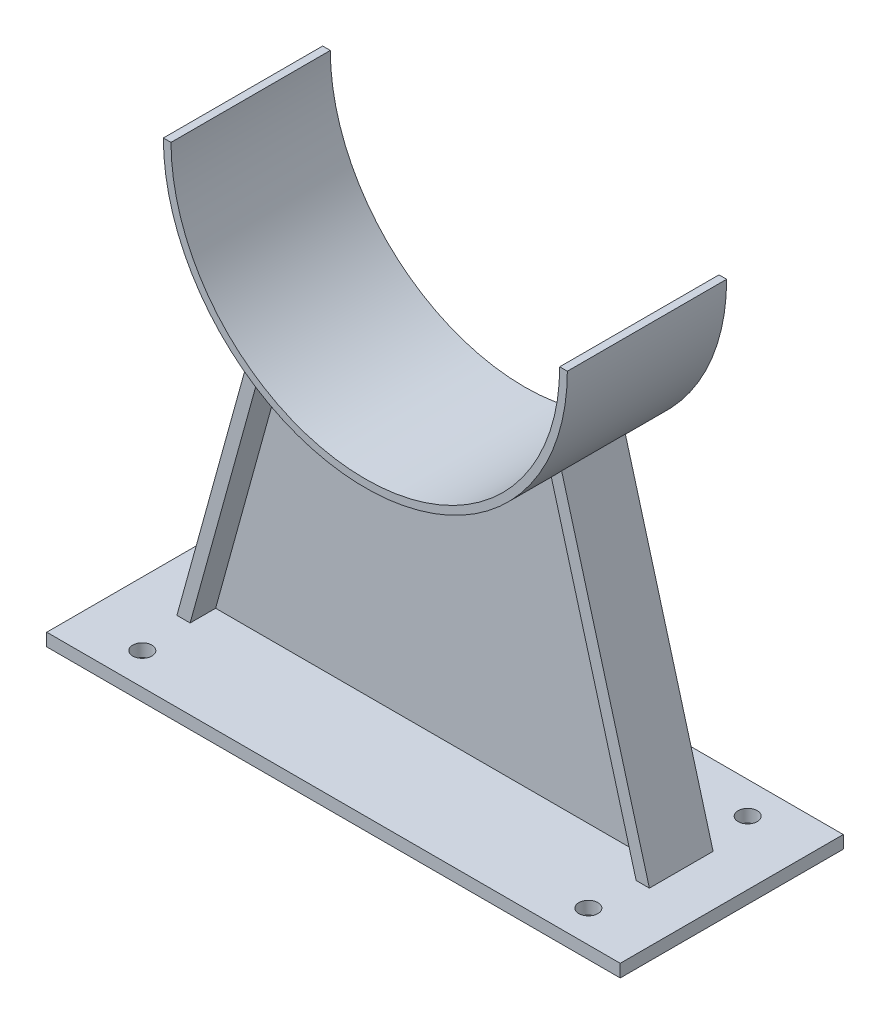
ISO-10303-21;
HEADER;
FILE_DESCRIPTION(('STEP AP214'),'2;1');
FILE_NAME('part.step','',(''),(''),'','','');
FILE_SCHEMA(('AUTOMOTIVE_DESIGN { 1 0 10303 214 1 1 1 1 }'));
ENDSEC;
DATA;
#1=APPLICATION_CONTEXT('core data for automotive mechanical design processes');
#2=APPLICATION_PROTOCOL_DEFINITION('international standard','automotive_design',2000,#1);
#3=PRODUCT_CONTEXT('',#1,'mechanical');
#4=PRODUCT('Part','Part','',(#3));
#5=PRODUCT_RELATED_PRODUCT_CATEGORY('part','',(#4));
#6=PRODUCT_DEFINITION_FORMATION('','',#4);
#7=PRODUCT_DEFINITION_CONTEXT('part definition',#1,'design');
#8=PRODUCT_DEFINITION('design','',#6,#7);
#9=PRODUCT_DEFINITION_SHAPE('','',#8);
#10=(LENGTH_UNIT() NAMED_UNIT(*) SI_UNIT(.MILLI.,.METRE.));
#11=(NAMED_UNIT(*) PLANE_ANGLE_UNIT() SI_UNIT($,.RADIAN.));
#12=(NAMED_UNIT(*) SI_UNIT($,.STERADIAN.) SOLID_ANGLE_UNIT());
#13=UNCERTAINTY_MEASURE_WITH_UNIT(LENGTH_MEASURE(1.E-05),#10,'distance_accuracy_value','');
#14=(GEOMETRIC_REPRESENTATION_CONTEXT(3) GLOBAL_UNCERTAINTY_ASSIGNED_CONTEXT((#13)) GLOBAL_UNIT_ASSIGNED_CONTEXT((#10,
#11,#12)) REPRESENTATION_CONTEXT('',''));
#15=CARTESIAN_POINT('',(0.,0.,0.));
#16=DIRECTION('',(0.,0.,1.));
#17=DIRECTION('',(1.,0.,0.));
#18=AXIS2_PLACEMENT_3D('',#15,#16,#17);
#19=CARTESIAN_POINT('',(0.,0.,125.));
#20=DIRECTION('',(0.,0.,-1.));
#21=DIRECTION('',(-1.,0.,0.));
#22=AXIS2_PLACEMENT_3D('',#19,#20,#21);
#23=CYLINDRICAL_SURFACE('',#22,317.);
#24=CARTESIAN_POINT('',(0.,0.,-125.));
#25=DIRECTION('',(0.,0.,1.));
#26=DIRECTION('',(1.,0.,0.));
#27=AXIS2_PLACEMENT_3D('',#24,#25,#26);
#28=CIRCLE('',#27,317.);
#29=CARTESIAN_POINT('',(-317.,0.,-125.));
#30=VERTEX_POINT('',#29);
#31=CARTESIAN_POINT('',(317.,0.,-125.));
#32=VERTEX_POINT('',#31);
#33=EDGE_CURVE('E204',#30,#32,#28,.T.);
#34=ORIENTED_EDGE('',*,*,#33,.T.);
#35=DIRECTION('',(0.,0.,-1.));
#36=VECTOR('',#35,1.);
#37=CARTESIAN_POINT('',(317.,0.,125.));
#38=LINE('',#37,#36);
#39=CARTESIAN_POINT('',(317.,0.,125.));
#40=VERTEX_POINT('',#39);
#41=EDGE_CURVE('E226',#40,#32,#38,.T.);
#42=ORIENTED_EDGE('',*,*,#41,.F.);
#43=CARTESIAN_POINT('',(0.,0.,125.));
#44=DIRECTION('',(0.,0.,1.));
#45=DIRECTION('',(1.,0.,0.));
#46=AXIS2_PLACEMENT_3D('',#43,#44,#45);
#47=CIRCLE('',#46,317.);
#48=CARTESIAN_POINT('',(-317.,0.,125.));
#49=VERTEX_POINT('',#48);
#50=EDGE_CURVE('E209',#49,#40,#47,.T.);
#51=ORIENTED_EDGE('',*,*,#50,.F.);
#52=DIRECTION('',(0.,0.,-1.));
#53=VECTOR('',#52,1.);
#54=CARTESIAN_POINT('',(-317.,0.,125.));
#55=LINE('',#54,#53);
#56=EDGE_CURVE('E223',#49,#30,#55,.T.);
#57=ORIENTED_EDGE('',*,*,#56,.T.);
#58=EDGE_LOOP('',(#34,#42,#51,#57));
#59=FACE_BOUND('',#58,.T.);
#60=DIRECTION('',(0.,0.,-1.));
#61=VECTOR('',#60,1.);
#62=CARTESIAN_POINT('',(216.821053663193,-231.25230958497,125.));
#63=LINE('',#62,#61);
#64=CARTESIAN_POINT('',(216.821053663193,-231.25230958497,50.));
#65=VERTEX_POINT('',#64);
#66=CARTESIAN_POINT('',(216.821053663193,-231.25230958497,9.99999999999999));
#67=VERTEX_POINT('',#66);
#68=EDGE_CURVE('E48',#65,#67,#63,.T.);
#69=ORIENTED_EDGE('',*,*,#68,.F.);
#70=CARTESIAN_POINT('',(0.,0.,50.));
#71=DIRECTION('',(0.,0.,1.));
#72=DIRECTION('',(0.,-1.,0.));
#73=AXIS2_PLACEMENT_3D('',#70,#71,#72);
#74=CIRCLE('',#73,317.);
#75=CARTESIAN_POINT('',(233.048785249764,-214.888956658106,50.0000000000001));
#76=VERTEX_POINT('',#75);
#77=EDGE_CURVE('E52',#65,#76,#74,.T.);
#78=ORIENTED_EDGE('',*,*,#77,.T.);
#79=DIRECTION('',(0.,0.,-1.));
#80=VECTOR('',#79,1.);
#81=CARTESIAN_POINT('',(233.048785249764,-214.888956658106,125.));
#82=LINE('',#81,#80);
#83=CARTESIAN_POINT('',(233.048785249764,-214.888956658106,-50.));
#84=VERTEX_POINT('',#83);
#85=EDGE_CURVE('E261',#76,#84,#82,.T.);
#86=ORIENTED_EDGE('',*,*,#85,.T.);
#87=CARTESIAN_POINT('',(0.,0.,-50.));
#88=DIRECTION('',(0.,0.,-1.));
#89=DIRECTION('',(0.,1.,0.));
#90=AXIS2_PLACEMENT_3D('',#87,#88,#89);
#91=CIRCLE('',#90,317.);
#92=CARTESIAN_POINT('',(216.821053663193,-231.25230958497,-50.));
#93=VERTEX_POINT('',#92);
#94=EDGE_CURVE('E181',#84,#93,#91,.T.);
#95=ORIENTED_EDGE('',*,*,#94,.T.);
#96=CARTESIAN_POINT('',(216.821053663193,-231.25230958497,-10.));
#97=VERTEX_POINT('',#96);
#98=EDGE_CURVE('E179',#97,#93,#63,.T.);
#99=ORIENTED_EDGE('',*,*,#98,.F.);
#100=CARTESIAN_POINT('',(0.,0.,-10.));
#101=DIRECTION('',(0.,0.,-1.));
#102=DIRECTION('',(1.,0.,0.));
#103=AXIS2_PLACEMENT_3D('',#100,#101,#102);
#104=CIRCLE('',#103,317.);
#105=CARTESIAN_POINT('',(-216.821053663193,-231.25230958497,-10.));
#106=VERTEX_POINT('',#105);
#107=EDGE_CURVE('E166',#97,#106,#104,.T.);
#108=ORIENTED_EDGE('',*,*,#107,.T.);
#109=DIRECTION('',(0.,0.,-1.));
#110=VECTOR('',#109,1.);
#111=CARTESIAN_POINT('',(-216.821053663193,-231.25230958497,125.));
#112=LINE('',#111,#110);
#113=CARTESIAN_POINT('',(-216.821053663193,-231.25230958497,-50.));
#114=VERTEX_POINT('',#113);
#115=EDGE_CURVE('E286',#114,#106,#112,.F.);
#116=ORIENTED_EDGE('',*,*,#115,.F.);
#117=CARTESIAN_POINT('',(0.,0.,-50.));
#118=DIRECTION('',(0.,0.,1.));
#119=DIRECTION('',(0.,-1.,0.));
#120=AXIS2_PLACEMENT_3D('',#117,#118,#119);
#121=CIRCLE('',#120,317.);
#122=CARTESIAN_POINT('',(-233.048785249764,-214.888956658106,-50.));
#123=VERTEX_POINT('',#122);
#124=EDGE_CURVE('E293',#123,#114,#121,.T.);
#125=ORIENTED_EDGE('',*,*,#124,.F.);
#126=DIRECTION('',(0.,0.,-1.));
#127=VECTOR('',#126,1.);
#128=CARTESIAN_POINT('',(-233.048785249764,-214.888956658106,125.));
#129=LINE('',#128,#127);
#130=CARTESIAN_POINT('',(-233.048785249764,-214.888956658106,50.));
#131=VERTEX_POINT('',#130);
#132=EDGE_CURVE('E288',#123,#131,#129,.F.);
#133=ORIENTED_EDGE('',*,*,#132,.T.);
#134=CARTESIAN_POINT('',(0.,0.,50.));
#135=DIRECTION('',(0.,0.,-1.));
#136=DIRECTION('',(0.,1.,0.));
#137=AXIS2_PLACEMENT_3D('',#134,#135,#136);
#138=CIRCLE('',#137,317.);
#139=CARTESIAN_POINT('',(-216.821053663193,-231.25230958497,50.0000000000001));
#140=VERTEX_POINT('',#139);
#141=EDGE_CURVE('E290',#140,#131,#138,.T.);
#142=ORIENTED_EDGE('',*,*,#141,.F.);
#143=CARTESIAN_POINT('',(-216.821053663193,-231.25230958497,9.99999999999999));
#144=VERTEX_POINT('',#143);
#145=EDGE_CURVE('E281',#144,#140,#112,.F.);
#146=ORIENTED_EDGE('',*,*,#145,.F.);
#147=CARTESIAN_POINT('',(0.,0.,10.));
#148=DIRECTION('',(0.,0.,-1.));
#149=DIRECTION('',(1.,0.,0.));
#150=AXIS2_PLACEMENT_3D('',#147,#148,#149);
#151=CIRCLE('',#150,317.);
#152=EDGE_CURVE('E191',#67,#144,#151,.T.);
#153=ORIENTED_EDGE('',*,*,#152,.F.);
#154=EDGE_LOOP('',(#69,#78,#86,#95,#99,#108,#116,#125,#133,#142,#146,#153));
#155=FACE_BOUND('',#154,.T.);
#156=ADVANCED_FACE('F33',(#59,#155),#23,.T.);
#157=CARTESIAN_POINT('',(0.,-713.189409477288,0.));
#158=DIRECTION('',(0.,-1.,0.));
#159=DIRECTION('',(0.,0.,-1.));
#160=AXIS2_PLACEMENT_3D('',#157,#158,#159);
#161=PLANE('',#160);
#162=DIRECTION('',(0.,0.,-1.));
#163=VECTOR('',#162,1.);
#164=CARTESIAN_POINT('',(-450.,-713.189409477288,175.));
#165=LINE('',#164,#163);
#166=CARTESIAN_POINT('',(-450.,-713.189409477288,175.));
#167=VERTEX_POINT('',#166);
#168=CARTESIAN_POINT('',(-450.,-713.189409477288,-175.));
#169=VERTEX_POINT('',#168);
#170=EDGE_CURVE('E318',#167,#169,#165,.T.);
#171=ORIENTED_EDGE('',*,*,#170,.F.);
#172=DIRECTION('',(-1.,0.,0.));
#173=VECTOR('',#172,1.);
#174=CARTESIAN_POINT('',(-450.,-713.189409477288,175.));
#175=LINE('',#174,#173);
#176=CARTESIAN_POINT('',(450.,-713.189409477288,175.));
#177=VERTEX_POINT('',#176);
#178=EDGE_CURVE('E325',#177,#167,#175,.T.);
#179=ORIENTED_EDGE('',*,*,#178,.F.);
#180=DIRECTION('',(0.,0.,1.));
#181=VECTOR('',#180,1.);
#182=CARTESIAN_POINT('',(450.,-713.189409477288,175.));
#183=LINE('',#182,#181);
#184=CARTESIAN_POINT('',(450.,-713.189409477288,-175.));
#185=VERTEX_POINT('',#184);
#186=EDGE_CURVE('E336',#185,#177,#183,.T.);
#187=ORIENTED_EDGE('',*,*,#186,.F.);
#188=DIRECTION('',(1.,0.,0.));
#189=VECTOR('',#188,1.);
#190=CARTESIAN_POINT('',(-450.,-713.189409477288,-175.));
#191=LINE('',#190,#189);
#192=EDGE_CURVE('E334',#169,#185,#191,.T.);
#193=ORIENTED_EDGE('',*,*,#192,.F.);
#194=EDGE_LOOP('',(#171,#179,#187,#193));
#195=FACE_BOUND('',#194,.T.);
#196=CARTESIAN_POINT('',(-350.,-713.189409477288,125.));
#197=DIRECTION('',(0.,-1.,0.));
#198=DIRECTION('',(0.,0.,-1.));
#199=AXIS2_PLACEMENT_3D('',#196,#197,#198);
#200=CIRCLE('',#199,15.);
#201=CARTESIAN_POINT('',(-350.,-713.189409477288,110.));
#202=VERTEX_POINT('',#201);
#203=EDGE_CURVE('E312',#202,#202,#200,.T.);
#204=ORIENTED_EDGE('',*,*,#203,.T.);
#205=EDGE_LOOP('',(#204));
#206=FACE_BOUND('',#205,.T.);
#207=CARTESIAN_POINT('',(350.,-713.189409477288,125.));
#208=DIRECTION('',(0.,-1.,0.));
#209=DIRECTION('',(0.,0.,-1.));
#210=AXIS2_PLACEMENT_3D('',#207,#208,#209);
#211=CIRCLE('',#210,15.);
#212=CARTESIAN_POINT('',(350.,-713.189409477288,110.));
#213=VERTEX_POINT('',#212);
#214=EDGE_CURVE('E306',#213,#213,#211,.T.);
#215=ORIENTED_EDGE('',*,*,#214,.T.);
#216=EDGE_LOOP('',(#215));
#217=FACE_BOUND('',#216,.T.);
#218=CARTESIAN_POINT('',(-350.,-713.189409477288,-125.));
#219=DIRECTION('',(0.,-1.,0.));
#220=DIRECTION('',(0.,0.,-1.));
#221=AXIS2_PLACEMENT_3D('',#218,#219,#220);
#222=CIRCLE('',#221,15.);
#223=CARTESIAN_POINT('',(-350.,-713.189409477288,-140.));
#224=VERTEX_POINT('',#223);
#225=EDGE_CURVE('E300',#224,#224,#222,.T.);
#226=ORIENTED_EDGE('',*,*,#225,.T.);
#227=EDGE_LOOP('',(#226));
#228=FACE_BOUND('',#227,.T.);
#229=CARTESIAN_POINT('',(350.,-713.189409477288,-125.));
#230=DIRECTION('',(0.,-1.,0.));
#231=DIRECTION('',(0.,0.,-1.));
#232=AXIS2_PLACEMENT_3D('',#229,#230,#231);
#233=CIRCLE('',#232,15.);
#234=CARTESIAN_POINT('',(350.,-713.189409477288,-140.));
#235=VERTEX_POINT('',#234);
#236=EDGE_CURVE('E296',#235,#235,#233,.T.);
#237=ORIENTED_EDGE('',*,*,#236,.T.);
#238=EDGE_LOOP('',(#237));
#239=FACE_BOUND('',#238,.T.);
#240=DIRECTION('',(0.,0.,1.));
#241=VECTOR('',#240,1.);
#242=CARTESIAN_POINT('',(350.,-713.189409477288,0.));
#243=LINE('',#242,#241);
#244=CARTESIAN_POINT('',(350.,-713.189409477288,-49.9999999999999));
#245=VERTEX_POINT('',#244);
#246=CARTESIAN_POINT('',(350.,-713.189409477288,-10.));
#247=VERTEX_POINT('',#246);
#248=EDGE_CURVE('E190',#245,#247,#243,.T.);
#249=ORIENTED_EDGE('',*,*,#248,.F.);
#250=DIRECTION('',(1.,0.,0.));
#251=VECTOR('',#250,1.);
#252=CARTESIAN_POINT('',(0.,-713.189409477288,-50.));
#253=LINE('',#252,#251);
#254=CARTESIAN_POINT('',(370.749595750637,-713.189409477288,-50.));
#255=VERTEX_POINT('',#254);
#256=EDGE_CURVE('E11',#245,#255,#253,.T.);
#257=ORIENTED_EDGE('',*,*,#256,.T.);
#258=DIRECTION('',(0.,0.,1.));
#259=VECTOR('',#258,1.);
#260=CARTESIAN_POINT('',(370.749595750637,-713.189409477288,0.));
#261=LINE('',#260,#259);
#262=CARTESIAN_POINT('',(370.749595750637,-713.189409477288,50.0000000000001));
#263=VERTEX_POINT('',#262);
#264=EDGE_CURVE('E41',#255,#263,#261,.T.);
#265=ORIENTED_EDGE('',*,*,#264,.T.);
#266=DIRECTION('',(-1.,0.,0.));
#267=VECTOR('',#266,1.);
#268=CARTESIAN_POINT('',(0.,-713.189409477288,50.0000000000001));
#269=LINE('',#268,#267);
#270=CARTESIAN_POINT('',(350.,-713.189409477288,50.0000000000001));
#271=VERTEX_POINT('',#270);
#272=EDGE_CURVE('E243',#263,#271,#269,.T.);
#273=ORIENTED_EDGE('',*,*,#272,.T.);
#274=CARTESIAN_POINT('',(350.,-713.189409477288,10.));
#275=VERTEX_POINT('',#274);
#276=EDGE_CURVE('E185',#275,#271,#243,.T.);
#277=ORIENTED_EDGE('',*,*,#276,.F.);
#278=DIRECTION('',(1.,0.,0.));
#279=VECTOR('',#278,1.);
#280=CARTESIAN_POINT('',(-350.,-713.189409477288,10.));
#281=LINE('',#280,#279);
#282=CARTESIAN_POINT('',(-350.,-713.189409477288,10.));
#283=VERTEX_POINT('',#282);
#284=EDGE_CURVE('E350',#283,#275,#281,.T.);
#285=ORIENTED_EDGE('',*,*,#284,.F.);
#286=DIRECTION('',(0.,0.,-1.));
#287=VECTOR('',#286,1.);
#288=CARTESIAN_POINT('',(-350.,-713.189409477288,0.));
#289=LINE('',#288,#287);
#290=CARTESIAN_POINT('',(-350.,-713.189409477288,50.0000000000001));
#291=VERTEX_POINT('',#290);
#292=EDGE_CURVE('E235',#291,#283,#289,.T.);
#293=ORIENTED_EDGE('',*,*,#292,.F.);
#294=DIRECTION('',(1.,0.,0.));
#295=VECTOR('',#294,1.);
#296=CARTESIAN_POINT('',(0.,-713.189409477288,50.0000000000001));
#297=LINE('',#296,#295);
#298=CARTESIAN_POINT('',(-370.749595750637,-713.189409477288,50.0000000000001));
#299=VERTEX_POINT('',#298);
#300=EDGE_CURVE('E240',#299,#291,#297,.T.);
#301=ORIENTED_EDGE('',*,*,#300,.F.);
#302=DIRECTION('',(0.,0.,-1.));
#303=VECTOR('',#302,1.);
#304=CARTESIAN_POINT('',(-370.749595750637,-713.189409477288,0.));
#305=LINE('',#304,#303);
#306=CARTESIAN_POINT('',(-370.749595750637,-713.189409477288,-49.9999999999999));
#307=VERTEX_POINT('',#306);
#308=EDGE_CURVE('E238',#299,#307,#305,.T.);
#309=ORIENTED_EDGE('',*,*,#308,.T.);
#310=DIRECTION('',(-1.,0.,0.));
#311=VECTOR('',#310,1.);
#312=CARTESIAN_POINT('',(0.,-713.189409477288,-50.));
#313=LINE('',#312,#311);
#314=CARTESIAN_POINT('',(-350.,-713.189409477288,-49.9999999999999));
#315=VERTEX_POINT('',#314);
#316=EDGE_CURVE('E234',#315,#307,#313,.T.);
#317=ORIENTED_EDGE('',*,*,#316,.F.);
#318=CARTESIAN_POINT('',(-350.,-713.189409477288,-10.));
#319=VERTEX_POINT('',#318);
#320=EDGE_CURVE('E225',#319,#315,#289,.T.);
#321=ORIENTED_EDGE('',*,*,#320,.F.);
#322=DIRECTION('',(1.,0.,0.));
#323=VECTOR('',#322,1.);
#324=CARTESIAN_POINT('',(-350.,-713.189409477288,-10.));
#325=LINE('',#324,#323);
#326=EDGE_CURVE('E192',#319,#247,#325,.T.);
#327=ORIENTED_EDGE('',*,*,#326,.T.);
#328=EDGE_LOOP('',(#249,#257,#265,#273,#277,#285,#293,#301,#309,#317,#321,#327));
#329=FACE_BOUND('',#328,.T.);
#330=ADVANCED_FACE('F247',(#195,#206,#217,#228,#239,#329),#161,.F.);
#331=CARTESIAN_POINT('',(0.,0.,125.));
#332=DIRECTION('',(0.,0.,-1.));
#333=DIRECTION('',(-1.,0.,0.));
#334=AXIS2_PLACEMENT_3D('',#331,#332,#333);
#335=CYLINDRICAL_SURFACE('',#334,305.);
#336=CARTESIAN_POINT('',(0.,0.,-125.));
#337=DIRECTION('',(0.,0.,1.));
#338=DIRECTION('',(1.,0.,0.));
#339=AXIS2_PLACEMENT_3D('',#336,#337,#338);
#340=CIRCLE('',#339,305.);
#341=CARTESIAN_POINT('',(-305.,0.,-125.));
#342=VERTEX_POINT('',#341);
#343=CARTESIAN_POINT('',(305.,0.,-125.));
#344=VERTEX_POINT('',#343);
#345=EDGE_CURVE('E215',#342,#344,#340,.T.);
#346=ORIENTED_EDGE('',*,*,#345,.F.);
#347=DIRECTION('',(0.,0.,-1.));
#348=VECTOR('',#347,1.);
#349=CARTESIAN_POINT('',(-305.,0.,125.));
#350=LINE('',#349,#348);
#351=CARTESIAN_POINT('',(-305.,0.,125.));
#352=VERTEX_POINT('',#351);
#353=EDGE_CURVE('E211',#352,#342,#350,.T.);
#354=ORIENTED_EDGE('',*,*,#353,.F.);
#355=CARTESIAN_POINT('',(0.,0.,125.));
#356=DIRECTION('',(0.,0.,1.));
#357=DIRECTION('',(1.,0.,0.));
#358=AXIS2_PLACEMENT_3D('',#355,#356,#357);
#359=CIRCLE('',#358,305.);
#360=CARTESIAN_POINT('',(305.,0.,125.));
#361=VERTEX_POINT('',#360);
#362=EDGE_CURVE('E203',#352,#361,#359,.T.);
#363=ORIENTED_EDGE('',*,*,#362,.T.);
#364=DIRECTION('',(0.,0.,-1.));
#365=VECTOR('',#364,1.);
#366=CARTESIAN_POINT('',(305.,0.,125.));
#367=LINE('',#366,#365);
#368=EDGE_CURVE('E229',#361,#344,#367,.T.);
#369=ORIENTED_EDGE('',*,*,#368,.T.);
#370=EDGE_LOOP('',(#346,#354,#363,#369));
#371=FACE_BOUND('',#370,.T.);
#372=ADVANCED_FACE('F394',(#371),#335,.F.);
#373=CARTESIAN_POINT('',(-317.,0.,125.));
#374=DIRECTION('',(0.,1.,0.));
#375=DIRECTION('',(-1.,0.,0.));
#376=AXIS2_PLACEMENT_3D('',#373,#374,#375);
#377=PLANE('',#376);
#378=DIRECTION('',(1.,0.,0.));
#379=VECTOR('',#378,1.);
#380=CARTESIAN_POINT('',(-317.,0.,-125.));
#381=LINE('',#380,#379);
#382=EDGE_CURVE('E212',#30,#342,#381,.T.);
#383=ORIENTED_EDGE('',*,*,#382,.F.);
#384=ORIENTED_EDGE('',*,*,#56,.F.);
#385=DIRECTION('',(1.,0.,0.));
#386=VECTOR('',#385,1.);
#387=CARTESIAN_POINT('',(-317.,0.,125.));
#388=LINE('',#387,#386);
#389=EDGE_CURVE('E200',#49,#352,#388,.T.);
#390=ORIENTED_EDGE('',*,*,#389,.T.);
#391=ORIENTED_EDGE('',*,*,#353,.T.);
#392=EDGE_LOOP('',(#383,#384,#390,#391));
#393=FACE_BOUND('',#392,.T.);
#394=ADVANCED_FACE('F35',(#393),#377,.T.);
#395=CARTESIAN_POINT('',(317.,0.,125.));
#396=DIRECTION('',(0.,-1.,0.));
#397=DIRECTION('',(1.,0.,0.));
#398=AXIS2_PLACEMENT_3D('',#395,#396,#397);
#399=PLANE('',#398);
#400=DIRECTION('',(-1.,0.,0.));
#401=VECTOR('',#400,1.);
#402=CARTESIAN_POINT('',(317.,0.,-125.));
#403=LINE('',#402,#401);
#404=EDGE_CURVE('E219',#32,#344,#403,.T.);
#405=ORIENTED_EDGE('',*,*,#404,.T.);
#406=ORIENTED_EDGE('',*,*,#368,.F.);
#407=DIRECTION('',(-1.,0.,0.));
#408=VECTOR('',#407,1.);
#409=CARTESIAN_POINT('',(317.,0.,125.));
#410=LINE('',#409,#408);
#411=EDGE_CURVE('E207',#40,#361,#410,.T.);
#412=ORIENTED_EDGE('',*,*,#411,.F.);
#413=ORIENTED_EDGE('',*,*,#41,.T.);
#414=EDGE_LOOP('',(#405,#406,#412,#413));
#415=FACE_BOUND('',#414,.T.);
#416=ADVANCED_FACE('F401',(#415),#399,.F.);
#417=CARTESIAN_POINT('',(0.,0.,125.));
#418=DIRECTION('',(0.,0.,1.));
#419=DIRECTION('',(1.,0.,0.));
#420=AXIS2_PLACEMENT_3D('',#417,#418,#419);
#421=PLANE('',#420);
#422=ORIENTED_EDGE('',*,*,#389,.F.);
#423=ORIENTED_EDGE('',*,*,#50,.T.);
#424=ORIENTED_EDGE('',*,*,#411,.T.);
#425=ORIENTED_EDGE('',*,*,#362,.F.);
#426=EDGE_LOOP('',(#422,#423,#424,#425));
#427=FACE_BOUND('',#426,.T.);
#428=ADVANCED_FACE('F403',(#427),#421,.T.);
#429=CARTESIAN_POINT('',(0.,0.,-125.));
#430=DIRECTION('',(0.,0.,1.));
#431=DIRECTION('',(1.,0.,0.));
#432=AXIS2_PLACEMENT_3D('',#429,#430,#431);
#433=PLANE('',#432);
#434=ORIENTED_EDGE('',*,*,#382,.T.);
#435=ORIENTED_EDGE('',*,*,#345,.T.);
#436=ORIENTED_EDGE('',*,*,#404,.F.);
#437=ORIENTED_EDGE('',*,*,#33,.F.);
#438=EDGE_LOOP('',(#434,#435,#436,#437));
#439=FACE_BOUND('',#438,.T.);
#440=ADVANCED_FACE('F399',(#439),#433,.F.);
#441=CARTESIAN_POINT('',(0.,0.,10.));
#442=DIRECTION('',(0.,0.,1.));
#443=DIRECTION('',(1.,0.,0.));
#444=AXIS2_PLACEMENT_3D('',#441,#442,#443);
#445=PLANE('',#444);
#446=ORIENTED_EDGE('',*,*,#152,.T.);
#447=DIRECTION('',(-0.266357892673614,-0.963874199784636,0.));
#448=VECTOR('',#447,1.);
#449=CARTESIAN_POINT('',(-216.821053663193,-231.25230958497,10.));
#450=LINE('',#449,#448);
#451=EDGE_CURVE('E195',#144,#283,#450,.T.);
#452=ORIENTED_EDGE('',*,*,#451,.T.);
#453=ORIENTED_EDGE('',*,*,#284,.T.);
#454=DIRECTION('',(-0.266357892673614,0.963874199784636,0.));
#455=VECTOR('',#454,1.);
#456=CARTESIAN_POINT('',(216.821053663193,-231.25230958497,10.));
#457=LINE('',#456,#455);
#458=EDGE_CURVE('E216',#275,#67,#457,.T.);
#459=ORIENTED_EDGE('',*,*,#458,.T.);
#460=EDGE_LOOP('',(#446,#452,#453,#459));
#461=FACE_BOUND('',#460,.T.);
#462=ADVANCED_FACE('F374',(#461),#445,.T.);
#463=CARTESIAN_POINT('',(0.,0.,-10.));
#464=DIRECTION('',(0.,0.,1.));
#465=DIRECTION('',(1.,0.,0.));
#466=AXIS2_PLACEMENT_3D('',#463,#464,#465);
#467=PLANE('',#466);
#468=ORIENTED_EDGE('',*,*,#107,.F.);
#469=DIRECTION('',(-0.266357892673614,0.963874199784636,0.));
#470=VECTOR('',#469,1.);
#471=CARTESIAN_POINT('',(216.821053663193,-231.25230958497,-10.));
#472=LINE('',#471,#470);
#473=EDGE_CURVE('E171',#247,#97,#472,.T.);
#474=ORIENTED_EDGE('',*,*,#473,.F.);
#475=ORIENTED_EDGE('',*,*,#326,.F.);
#476=DIRECTION('',(-0.266357892673614,-0.963874199784636,0.));
#477=VECTOR('',#476,1.);
#478=CARTESIAN_POINT('',(-216.821053663193,-231.25230958497,-10.));
#479=LINE('',#478,#477);
#480=EDGE_CURVE('E174',#106,#319,#479,.T.);
#481=ORIENTED_EDGE('',*,*,#480,.F.);
#482=EDGE_LOOP('',(#468,#474,#475,#481));
#483=FACE_BOUND('',#482,.T.);
#484=ADVANCED_FACE('F168',(#483),#467,.F.);
#485=CARTESIAN_POINT('',(0.,-733.189409477288,0.));
#486=DIRECTION('',(0.,-1.,0.));
#487=DIRECTION('',(0.,0.,-1.));
#488=AXIS2_PLACEMENT_3D('',#485,#486,#487);
#489=PLANE('',#488);
#490=CARTESIAN_POINT('',(-350.,-733.189409477288,-125.));
#491=DIRECTION('',(0.,-1.,0.));
#492=DIRECTION('',(0.,0.,-1.));
#493=AXIS2_PLACEMENT_3D('',#490,#491,#492);
#494=CIRCLE('',#493,15.);
#495=CARTESIAN_POINT('',(-350.,-733.189409477288,-140.));
#496=VERTEX_POINT('',#495);
#497=EDGE_CURVE('E303',#496,#496,#494,.T.);
#498=ORIENTED_EDGE('',*,*,#497,.F.);
#499=EDGE_LOOP('',(#498));
#500=FACE_BOUND('',#499,.T.);
#501=CARTESIAN_POINT('',(-350.,-733.189409477288,125.));
#502=DIRECTION('',(0.,-1.,0.));
#503=DIRECTION('',(0.,0.,-1.));
#504=AXIS2_PLACEMENT_3D('',#501,#502,#503);
#505=CIRCLE('',#504,15.);
#506=CARTESIAN_POINT('',(-350.,-733.189409477288,110.));
#507=VERTEX_POINT('',#506);
#508=EDGE_CURVE('E315',#507,#507,#505,.T.);
#509=ORIENTED_EDGE('',*,*,#508,.F.);
#510=EDGE_LOOP('',(#509));
#511=FACE_BOUND('',#510,.T.);
#512=DIRECTION('',(0.,0.,-1.));
#513=VECTOR('',#512,1.);
#514=CARTESIAN_POINT('',(-450.,-733.189409477288,175.));
#515=LINE('',#514,#513);
#516=CARTESIAN_POINT('',(-450.,-733.189409477288,175.));
#517=VERTEX_POINT('',#516);
#518=CARTESIAN_POINT('',(-450.,-733.189409477288,-175.));
#519=VERTEX_POINT('',#518);
#520=EDGE_CURVE('E321',#517,#519,#515,.T.);
#521=ORIENTED_EDGE('',*,*,#520,.T.);
#522=DIRECTION('',(1.,0.,0.));
#523=VECTOR('',#522,1.);
#524=CARTESIAN_POINT('',(-450.,-733.189409477288,-175.));
#525=LINE('',#524,#523);
#526=CARTESIAN_POINT('',(450.,-733.189409477288,-175.));
#527=VERTEX_POINT('',#526);
#528=EDGE_CURVE('E324',#519,#527,#525,.T.);
#529=ORIENTED_EDGE('',*,*,#528,.T.);
#530=DIRECTION('',(0.,0.,1.));
#531=VECTOR('',#530,1.);
#532=CARTESIAN_POINT('',(450.,-733.189409477288,175.));
#533=LINE('',#532,#531);
#534=CARTESIAN_POINT('',(450.,-733.189409477288,175.));
#535=VERTEX_POINT('',#534);
#536=EDGE_CURVE('E327',#527,#535,#533,.T.);
#537=ORIENTED_EDGE('',*,*,#536,.T.);
#538=DIRECTION('',(-1.,0.,0.));
#539=VECTOR('',#538,1.);
#540=CARTESIAN_POINT('',(-450.,-733.189409477288,175.));
#541=LINE('',#540,#539);
#542=EDGE_CURVE('E329',#535,#517,#541,.T.);
#543=ORIENTED_EDGE('',*,*,#542,.T.);
#544=EDGE_LOOP('',(#521,#529,#537,#543));
#545=FACE_BOUND('',#544,.T.);
#546=CARTESIAN_POINT('',(350.,-733.189409477288,125.));
#547=DIRECTION('',(0.,-1.,0.));
#548=DIRECTION('',(0.,0.,-1.));
#549=AXIS2_PLACEMENT_3D('',#546,#547,#548);
#550=CIRCLE('',#549,15.);
#551=CARTESIAN_POINT('',(350.,-733.189409477288,110.));
#552=VERTEX_POINT('',#551);
#553=EDGE_CURVE('E309',#552,#552,#550,.T.);
#554=ORIENTED_EDGE('',*,*,#553,.F.);
#555=EDGE_LOOP('',(#554));
#556=FACE_BOUND('',#555,.T.);
#557=CARTESIAN_POINT('',(350.,-733.189409477288,-125.));
#558=DIRECTION('',(0.,-1.,0.));
#559=DIRECTION('',(0.,0.,-1.));
#560=AXIS2_PLACEMENT_3D('',#557,#558,#559);
#561=CIRCLE('',#560,15.);
#562=CARTESIAN_POINT('',(350.,-733.189409477288,-140.));
#563=VERTEX_POINT('',#562);
#564=EDGE_CURVE('E297',#563,#563,#561,.T.);
#565=ORIENTED_EDGE('',*,*,#564,.F.);
#566=EDGE_LOOP('',(#565));
#567=FACE_BOUND('',#566,.T.);
#568=ADVANCED_FACE('F430',(#500,#511,#545,#556,#567),#489,.T.);
#569=CARTESIAN_POINT('',(-450.,-733.189409477288,175.));
#570=DIRECTION('',(1.,0.,0.));
#571=DIRECTION('',(0.,0.,-1.));
#572=AXIS2_PLACEMENT_3D('',#569,#570,#571);
#573=PLANE('',#572);
#574=ORIENTED_EDGE('',*,*,#170,.T.);
#575=DIRECTION('',(0.,1.,0.));
#576=VECTOR('',#575,1.);
#577=CARTESIAN_POINT('',(-450.,-733.189409477288,-175.));
#578=LINE('',#577,#576);
#579=EDGE_CURVE('E176',#519,#169,#578,.T.);
#580=ORIENTED_EDGE('',*,*,#579,.F.);
#581=ORIENTED_EDGE('',*,*,#520,.F.);
#582=DIRECTION('',(0.,1.,0.));
#583=VECTOR('',#582,1.);
#584=CARTESIAN_POINT('',(-450.,-733.189409477288,175.));
#585=LINE('',#584,#583);
#586=EDGE_CURVE('E331',#517,#167,#585,.T.);
#587=ORIENTED_EDGE('',*,*,#586,.T.);
#588=EDGE_LOOP('',(#574,#580,#581,#587));
#589=FACE_BOUND('',#588,.T.);
#590=ADVANCED_FACE('F433',(#589),#573,.F.);
#591=CARTESIAN_POINT('',(-450.,-733.189409477288,-175.));
#592=DIRECTION('',(0.,0.,1.));
#593=DIRECTION('',(1.,0.,0.));
#594=AXIS2_PLACEMENT_3D('',#591,#592,#593);
#595=PLANE('',#594);
#596=ORIENTED_EDGE('',*,*,#192,.T.);
#597=DIRECTION('',(0.,1.,0.));
#598=VECTOR('',#597,1.);
#599=CARTESIAN_POINT('',(450.,-733.189409477288,-175.));
#600=LINE('',#599,#598);
#601=EDGE_CURVE('E344',#527,#185,#600,.T.);
#602=ORIENTED_EDGE('',*,*,#601,.F.);
#603=ORIENTED_EDGE('',*,*,#528,.F.);
#604=ORIENTED_EDGE('',*,*,#579,.T.);
#605=EDGE_LOOP('',(#596,#602,#603,#604));
#606=FACE_BOUND('',#605,.T.);
#607=ADVANCED_FACE('F436',(#606),#595,.F.);
#608=CARTESIAN_POINT('',(450.,-733.189409477288,175.));
#609=DIRECTION('',(-1.,0.,0.));
#610=DIRECTION('',(0.,0.,1.));
#611=AXIS2_PLACEMENT_3D('',#608,#609,#610);
#612=PLANE('',#611);
#613=ORIENTED_EDGE('',*,*,#186,.T.);
#614=DIRECTION('',(0.,1.,0.));
#615=VECTOR('',#614,1.);
#616=CARTESIAN_POINT('',(450.,-733.189409477288,175.));
#617=LINE('',#616,#615);
#618=EDGE_CURVE('E341',#535,#177,#617,.T.);
#619=ORIENTED_EDGE('',*,*,#618,.F.);
#620=ORIENTED_EDGE('',*,*,#536,.F.);
#621=ORIENTED_EDGE('',*,*,#601,.T.);
#622=EDGE_LOOP('',(#613,#619,#620,#621));
#623=FACE_BOUND('',#622,.T.);
#624=ADVANCED_FACE('F440',(#623),#612,.F.);
#625=CARTESIAN_POINT('',(-450.,-733.189409477288,175.));
#626=DIRECTION('',(0.,0.,-1.));
#627=DIRECTION('',(-1.,0.,0.));
#628=AXIS2_PLACEMENT_3D('',#625,#626,#627);
#629=PLANE('',#628);
#630=ORIENTED_EDGE('',*,*,#178,.T.);
#631=ORIENTED_EDGE('',*,*,#586,.F.);
#632=ORIENTED_EDGE('',*,*,#542,.F.);
#633=ORIENTED_EDGE('',*,*,#618,.T.);
#634=EDGE_LOOP('',(#630,#631,#632,#633));
#635=FACE_BOUND('',#634,.T.);
#636=ADVANCED_FACE('F444',(#635),#629,.F.);
#637=CARTESIAN_POINT('',(-350.,-733.189409477288,125.));
#638=DIRECTION('',(0.,1.,0.));
#639=DIRECTION('',(0.,0.,1.));
#640=AXIS2_PLACEMENT_3D('',#637,#638,#639);
#641=CYLINDRICAL_SURFACE('',#640,15.);
#642=ORIENTED_EDGE('',*,*,#508,.T.);
#643=EDGE_LOOP('',(#642));
#644=FACE_BOUND('',#643,.T.);
#645=ORIENTED_EDGE('',*,*,#203,.F.);
#646=EDGE_LOOP('',(#645));
#647=FACE_BOUND('',#646,.T.);
#648=ADVANCED_FACE('F447',(#644,#647),#641,.F.);
#649=CARTESIAN_POINT('',(350.,-733.189409477288,125.));
#650=DIRECTION('',(0.,1.,0.));
#651=DIRECTION('',(0.,0.,1.));
#652=AXIS2_PLACEMENT_3D('',#649,#650,#651);
#653=CYLINDRICAL_SURFACE('',#652,15.);
#654=ORIENTED_EDGE('',*,*,#553,.T.);
#655=EDGE_LOOP('',(#654));
#656=FACE_BOUND('',#655,.T.);
#657=ORIENTED_EDGE('',*,*,#214,.F.);
#658=EDGE_LOOP('',(#657));
#659=FACE_BOUND('',#658,.T.);
#660=ADVANCED_FACE('F455',(#656,#659),#653,.F.);
#661=CARTESIAN_POINT('',(-350.,-733.189409477288,-125.));
#662=DIRECTION('',(0.,1.,0.));
#663=DIRECTION('',(0.,0.,1.));
#664=AXIS2_PLACEMENT_3D('',#661,#662,#663);
#665=CYLINDRICAL_SURFACE('',#664,15.);
#666=ORIENTED_EDGE('',*,*,#497,.T.);
#667=EDGE_LOOP('',(#666));
#668=FACE_BOUND('',#667,.T.);
#669=ORIENTED_EDGE('',*,*,#225,.F.);
#670=EDGE_LOOP('',(#669));
#671=FACE_BOUND('',#670,.T.);
#672=ADVANCED_FACE('F459',(#668,#671),#665,.F.);
#673=CARTESIAN_POINT('',(350.,-733.189409477288,-125.));
#674=DIRECTION('',(0.,1.,0.));
#675=DIRECTION('',(0.,0.,1.));
#676=AXIS2_PLACEMENT_3D('',#673,#674,#675);
#677=CYLINDRICAL_SURFACE('',#676,15.);
#678=ORIENTED_EDGE('',*,*,#564,.T.);
#679=EDGE_LOOP('',(#678));
#680=FACE_BOUND('',#679,.T.);
#681=ORIENTED_EDGE('',*,*,#236,.F.);
#682=EDGE_LOOP('',(#681));
#683=FACE_BOUND('',#682,.T.);
#684=ADVANCED_FACE('F463',(#680,#683),#677,.F.);
#685=CARTESIAN_POINT('',(-142.067675448171,39.2591135418592,0.));
#686=DIRECTION('',(-0.963874199784636,0.266357892673614,0.));
#687=DIRECTION('',(-0.266357892673614,-0.963874199784636,0.));
#688=AXIS2_PLACEMENT_3D('',#685,#686,#687);
#689=PLANE('',#688);
#690=DIRECTION('',(-0.266357892673614,-0.963874199784635,0.));
#691=VECTOR('',#690,1.);
#692=CARTESIAN_POINT('',(-211.493895809721,-211.974825589277,-50.));
#693=LINE('',#692,#691);
#694=EDGE_CURVE('E273',#114,#315,#693,.T.);
#695=ORIENTED_EDGE('',*,*,#694,.F.);
#696=ORIENTED_EDGE('',*,*,#115,.T.);
#697=ORIENTED_EDGE('',*,*,#480,.T.);
#698=ORIENTED_EDGE('',*,*,#320,.T.);
#699=EDGE_LOOP('',(#695,#696,#697,#698));
#700=FACE_BOUND('',#699,.T.);
#701=ADVANCED_FACE('F356',(#700),#689,.F.);
#702=CARTESIAN_POINT('',(-161.345159443864,44.5862713953315,0.));
#703=DIRECTION('',(-0.963874199784636,0.266357892673614,0.));
#704=DIRECTION('',(-0.266357892673614,-0.963874199784636,0.));
#705=AXIS2_PLACEMENT_3D('',#702,#703,#704);
#706=PLANE('',#705);
#707=ORIENTED_EDGE('',*,*,#132,.F.);
#708=DIRECTION('',(-0.266357892673614,-0.963874199784635,0.));
#709=VECTOR('',#708,1.);
#710=CARTESIAN_POINT('',(-230.771379805413,-206.647667735805,-50.));
#711=LINE('',#710,#709);
#712=EDGE_CURVE('E274',#123,#307,#711,.T.);
#713=ORIENTED_EDGE('',*,*,#712,.T.);
#714=ORIENTED_EDGE('',*,*,#308,.F.);
#715=DIRECTION('',(0.266357892673614,0.963874199784635,0.));
#716=VECTOR('',#715,1.);
#717=CARTESIAN_POINT('',(-230.771379805413,-206.647667735805,50.));
#718=LINE('',#717,#716);
#719=EDGE_CURVE('E277',#299,#131,#718,.T.);
#720=ORIENTED_EDGE('',*,*,#719,.T.);
#721=EDGE_LOOP('',(#707,#713,#714,#720));
#722=FACE_BOUND('',#721,.T.);
#723=ADVANCED_FACE('F363',(#722),#706,.T.);
#724=ORIENTED_EDGE('',*,*,#451,.F.);
#725=ORIENTED_EDGE('',*,*,#145,.T.);
#726=DIRECTION('',(0.266357892673614,0.963874199784635,0.));
#727=VECTOR('',#726,1.);
#728=CARTESIAN_POINT('',(-211.493895809721,-211.974825589277,50.));
#729=LINE('',#728,#727);
#730=EDGE_CURVE('E278',#291,#140,#729,.T.);
#731=ORIENTED_EDGE('',*,*,#730,.F.);
#732=ORIENTED_EDGE('',*,*,#292,.T.);
#733=EDGE_LOOP('',(#724,#725,#731,#732));
#734=FACE_BOUND('',#733,.T.);
#735=ADVANCED_FACE('F372',(#734),#689,.F.);
#736=CARTESIAN_POINT('',(-230.771379805413,-206.647667735805,50.));
#737=DIRECTION('',(0.,0.,-1.));
#738=DIRECTION('',(0.,1.,0.));
#739=AXIS2_PLACEMENT_3D('',#736,#737,#738);
#740=PLANE('',#739);
#741=ORIENTED_EDGE('',*,*,#730,.T.);
#742=ORIENTED_EDGE('',*,*,#141,.T.);
#743=ORIENTED_EDGE('',*,*,#719,.F.);
#744=ORIENTED_EDGE('',*,*,#300,.T.);
#745=EDGE_LOOP('',(#741,#742,#743,#744));
#746=FACE_BOUND('',#745,.T.);
#747=ADVANCED_FACE('F367',(#746),#740,.F.);
#748=CARTESIAN_POINT('',(-230.771379805413,-206.647667735805,-50.));
#749=DIRECTION('',(0.,0.,1.));
#750=DIRECTION('',(0.,-1.,0.));
#751=AXIS2_PLACEMENT_3D('',#748,#749,#750);
#752=PLANE('',#751);
#753=ORIENTED_EDGE('',*,*,#712,.F.);
#754=ORIENTED_EDGE('',*,*,#124,.T.);
#755=ORIENTED_EDGE('',*,*,#694,.T.);
#756=ORIENTED_EDGE('',*,*,#316,.T.);
#757=EDGE_LOOP('',(#753,#754,#755,#756));
#758=FACE_BOUND('',#757,.T.);
#759=ADVANCED_FACE('F360',(#758),#752,.F.);
#760=CARTESIAN_POINT('',(142.067675448171,39.2591135418592,0.));
#761=DIRECTION('',(0.963874199784636,0.266357892673614,0.));
#762=DIRECTION('',(0.266357892673614,-0.963874199784636,0.));
#763=AXIS2_PLACEMENT_3D('',#760,#761,#762);
#764=PLANE('',#763);
#765=DIRECTION('',(0.266357892673614,-0.963874199784635,0.));
#766=VECTOR('',#765,1.);
#767=CARTESIAN_POINT('',(211.493895809721,-211.974825589277,-50.));
#768=LINE('',#767,#766);
#769=EDGE_CURVE('E266',#93,#245,#768,.T.);
#770=ORIENTED_EDGE('',*,*,#769,.T.);
#771=ORIENTED_EDGE('',*,*,#248,.T.);
#772=ORIENTED_EDGE('',*,*,#473,.T.);
#773=ORIENTED_EDGE('',*,*,#98,.T.);
#774=EDGE_LOOP('',(#770,#771,#772,#773));
#775=FACE_BOUND('',#774,.T.);
#776=ADVANCED_FACE('F189',(#775),#764,.F.);
#777=CARTESIAN_POINT('',(161.345159443864,44.5862713953315,0.));
#778=DIRECTION('',(0.963874199784636,0.266357892673614,0.));
#779=DIRECTION('',(0.266357892673614,-0.963874199784636,0.));
#780=AXIS2_PLACEMENT_3D('',#777,#778,#779);
#781=PLANE('',#780);
#782=ORIENTED_EDGE('',*,*,#85,.F.);
#783=DIRECTION('',(-0.266357892673614,0.963874199784635,0.));
#784=VECTOR('',#783,1.);
#785=CARTESIAN_POINT('',(230.771379805413,-206.647667735805,50.));
#786=LINE('',#785,#784);
#787=EDGE_CURVE('E186',#263,#76,#786,.T.);
#788=ORIENTED_EDGE('',*,*,#787,.F.);
#789=ORIENTED_EDGE('',*,*,#264,.F.);
#790=DIRECTION('',(0.266357892673614,-0.963874199784635,0.));
#791=VECTOR('',#790,1.);
#792=CARTESIAN_POINT('',(230.771379805413,-206.647667735805,-50.));
#793=LINE('',#792,#791);
#794=EDGE_CURVE('E262',#84,#255,#793,.T.);
#795=ORIENTED_EDGE('',*,*,#794,.F.);
#796=EDGE_LOOP('',(#782,#788,#789,#795));
#797=FACE_BOUND('',#796,.T.);
#798=ADVANCED_FACE('F260',(#797),#781,.T.);
#799=DIRECTION('',(-0.266357892673614,0.963874199784635,0.));
#800=VECTOR('',#799,1.);
#801=CARTESIAN_POINT('',(211.493895809721,-211.974825589277,50.));
#802=LINE('',#801,#800);
#803=EDGE_CURVE('E259',#271,#65,#802,.T.);
#804=ORIENTED_EDGE('',*,*,#803,.T.);
#805=ORIENTED_EDGE('',*,*,#68,.T.);
#806=ORIENTED_EDGE('',*,*,#458,.F.);
#807=ORIENTED_EDGE('',*,*,#276,.T.);
#808=EDGE_LOOP('',(#804,#805,#806,#807));
#809=FACE_BOUND('',#808,.T.);
#810=ADVANCED_FACE('F378',(#809),#764,.F.);
#811=CARTESIAN_POINT('',(230.771379805413,-206.647667735805,50.));
#812=DIRECTION('',(0.,0.,1.));
#813=DIRECTION('',(0.,-1.,0.));
#814=AXIS2_PLACEMENT_3D('',#811,#812,#813);
#815=PLANE('',#814);
#816=ORIENTED_EDGE('',*,*,#77,.F.);
#817=ORIENTED_EDGE('',*,*,#803,.F.);
#818=ORIENTED_EDGE('',*,*,#272,.F.);
#819=ORIENTED_EDGE('',*,*,#787,.T.);
#820=EDGE_LOOP('',(#816,#817,#818,#819));
#821=FACE_BOUND('',#820,.T.);
#822=ADVANCED_FACE('F257',(#821),#815,.T.);
#823=CARTESIAN_POINT('',(230.771379805413,-206.647667735805,-50.));
#824=DIRECTION('',(0.,0.,-1.));
#825=DIRECTION('',(0.,1.,0.));
#826=AXIS2_PLACEMENT_3D('',#823,#824,#825);
#827=PLANE('',#826);
#828=ORIENTED_EDGE('',*,*,#94,.F.);
#829=ORIENTED_EDGE('',*,*,#794,.T.);
#830=ORIENTED_EDGE('',*,*,#256,.F.);
#831=ORIENTED_EDGE('',*,*,#769,.F.);
#832=EDGE_LOOP('',(#828,#829,#830,#831));
#833=FACE_BOUND('',#832,.T.);
#834=ADVANCED_FACE('F380',(#833),#827,.T.);
#835=CLOSED_SHELL('',(#156,#330,#372,#394,#416,#428,#440,#462,#484,#568,#590,#607,#624,#636,
#648,#660,#672,#684,#701,#723,#735,#747,#759,#776,#798,#810,#822,#834));
#836=MANIFOLD_SOLID_BREP('B2',#835);
#837=ADVANCED_BREP_SHAPE_REPRESENTATION('',(#18,#836),#14);
#838=SHAPE_DEFINITION_REPRESENTATION(#9,#837);
ENDSEC;
END-ISO-10303-21;
